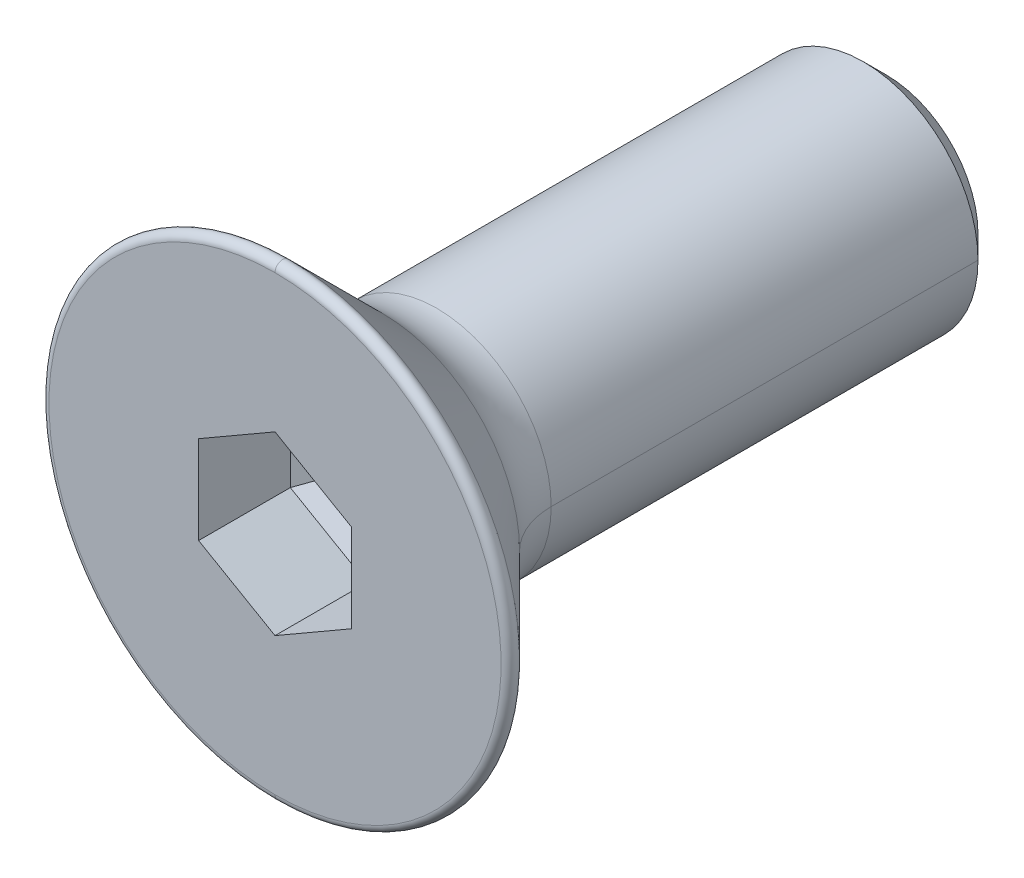
ISO-10303-21;
HEADER;
FILE_DESCRIPTION(('STEP AP214'),'2;1');
FILE_NAME('part.step','',(''),(''),'','','');
FILE_SCHEMA(('AUTOMOTIVE_DESIGN { 1 0 10303 214 1 1 1 1 }'));
ENDSEC;
DATA;
#1=APPLICATION_CONTEXT('core data for automotive mechanical design processes');
#2=APPLICATION_PROTOCOL_DEFINITION('international standard','automotive_design',2000,#1);
#3=PRODUCT_CONTEXT('',#1,'mechanical');
#4=PRODUCT('Part','Part','',(#3));
#5=PRODUCT_RELATED_PRODUCT_CATEGORY('part','',(#4));
#6=PRODUCT_DEFINITION_FORMATION('','',#4);
#7=PRODUCT_DEFINITION_CONTEXT('part definition',#1,'design');
#8=PRODUCT_DEFINITION('design','',#6,#7);
#9=PRODUCT_DEFINITION_SHAPE('','',#8);
#10=(LENGTH_UNIT() NAMED_UNIT(*) SI_UNIT(.MILLI.,.METRE.));
#11=(NAMED_UNIT(*) PLANE_ANGLE_UNIT() SI_UNIT($,.RADIAN.));
#12=(NAMED_UNIT(*) SI_UNIT($,.STERADIAN.) SOLID_ANGLE_UNIT());
#13=UNCERTAINTY_MEASURE_WITH_UNIT(LENGTH_MEASURE(1.E-05),#10,'distance_accuracy_value','');
#14=(GEOMETRIC_REPRESENTATION_CONTEXT(3) GLOBAL_UNCERTAINTY_ASSIGNED_CONTEXT((#13)) GLOBAL_UNIT_ASSIGNED_CONTEXT((#10,
#11,#12)) REPRESENTATION_CONTEXT('',''));
#15=CARTESIAN_POINT('',(0.,0.,0.));
#16=DIRECTION('',(0.,0.,1.));
#17=DIRECTION('',(1.,0.,0.));
#18=AXIS2_PLACEMENT_3D('',#15,#16,#17);
#19=CARTESIAN_POINT('',(0.,0.,0.));
#20=DIRECTION('',(0.,0.,1.));
#21=DIRECTION('',(1.,0.,0.));
#22=AXIS2_PLACEMENT_3D('',#19,#20,#21);
#23=PLANE('',#22);
#24=CARTESIAN_POINT('',(0.,0.,-1.952411139428E-07));
#25=DIRECTION('',(0.,0.,-1.));
#26=DIRECTION('',(1.,0.,0.));
#27=AXIS2_PLACEMENT_3D('',#24,#25,#26);
#28=CIRCLE('',#27,1.200000028684);
#29=CARTESIAN_POINT('',(1.200000028684,0.,-1.952411139428E-07));
#30=VERTEX_POINT('',#29);
#31=CARTESIAN_POINT('',(-1.200000028684,0.,-1.952411139428E-07));
#32=VERTEX_POINT('',#31);
#33=EDGE_CURVE('E11',#30,#32,#28,.T.);
#34=ORIENTED_EDGE('',*,*,#33,.T.);
#35=CARTESIAN_POINT('',(0.,0.,-1.952411139428E-07));
#36=DIRECTION('',(0.,0.,-1.));
#37=DIRECTION('',(-1.,0.,0.));
#38=AXIS2_PLACEMENT_3D('',#35,#36,#37);
#39=CIRCLE('',#38,1.200000028684);
#40=EDGE_CURVE('E28',#32,#30,#39,.T.);
#41=ORIENTED_EDGE('',*,*,#40,.T.);
#42=EDGE_LOOP('',(#34,#41));
#43=FACE_BOUND('',#42,.T.);
#44=ADVANCED_FACE('F17',(#43),#23,.F.);
#45=CARTESIAN_POINT('',(0.,0.,0.1499999993561));
#46=DIRECTION('',(0.,0.,1.));
#47=DIRECTION('',(0.,-1.,0.));
#48=AXIS2_PLACEMENT_3D('',#45,#46,#47);
#49=CONICAL_SURFACE('',#48,1.350000251272,0.785398256699461);
#50=DIRECTION('',(-0.707106770190798,1.62505001967499E-11,0.707106792182297));
#51=VECTOR('',#50,1.);
#52=CARTESIAN_POINT('',(-1.200000074636,-1.103087927678E-10,-7.464715801042E-08));
#53=LINE('',#52,#51);
#54=CARTESIAN_POINT('',(-1.5,0.,0.3000002107158));
#55=VERTEX_POINT('',#54);
#56=EDGE_CURVE('E21',#32,#55,#53,.T.);
#57=ORIENTED_EDGE('',*,*,#56,.T.);
#58=CARTESIAN_POINT('',(0.,0.,0.3000002107158));
#59=DIRECTION('',(0.,0.,-1.));
#60=DIRECTION('',(-1.,0.,0.));
#61=AXIS2_PLACEMENT_3D('',#58,#59,#60);
#62=CIRCLE('',#61,1.5);
#63=CARTESIAN_POINT('',(1.5,0.,0.3000002107158));
#64=VERTEX_POINT('',#63);
#65=EDGE_CURVE('E236',#55,#64,#62,.T.);
#66=ORIENTED_EDGE('',*,*,#65,.T.);
#67=DIRECTION('',(0.707106770190798,-1.62504382324799E-11,0.707106792182297));
#68=VECTOR('',#67,1.);
#69=CARTESIAN_POINT('',(1.200000074636,1.103092895437E-10,-7.464715778838E-08));
#70=LINE('',#69,#68);
#71=EDGE_CURVE('E232',#30,#64,#70,.T.);
#72=ORIENTED_EDGE('',*,*,#71,.F.);
#73=ORIENTED_EDGE('',*,*,#40,.F.);
#74=EDGE_LOOP('',(#57,#66,#72,#73));
#75=FACE_BOUND('',#74,.T.);
#76=ADVANCED_FACE('F369',(#75),#49,.T.);
#77=CARTESIAN_POINT('',(0.,0.,0.1499999993561));
#78=DIRECTION('',(0.,0.,1.));
#79=DIRECTION('',(0.,-1.,0.));
#80=AXIS2_PLACEMENT_3D('',#77,#78,#79);
#81=CONICAL_SURFACE('',#80,1.350000251272,0.785398256699461);
#82=ORIENTED_EDGE('',*,*,#71,.T.);
#83=CARTESIAN_POINT('',(0.,0.,0.3000002107158));
#84=DIRECTION('',(0.,0.,-1.));
#85=DIRECTION('',(1.,0.,0.));
#86=AXIS2_PLACEMENT_3D('',#83,#84,#85);
#87=CIRCLE('',#86,1.5);
#88=EDGE_CURVE('E237',#64,#55,#87,.T.);
#89=ORIENTED_EDGE('',*,*,#88,.T.);
#90=ORIENTED_EDGE('',*,*,#56,.F.);
#91=ORIENTED_EDGE('',*,*,#33,.F.);
#92=EDGE_LOOP('',(#82,#89,#90,#91));
#93=FACE_BOUND('',#92,.T.);
#94=ADVANCED_FACE('F361',(#93),#81,.T.);
#95=CARTESIAN_POINT('',(0.,0.,0.));
#96=DIRECTION('',(0.,0.,1.));
#97=DIRECTION('',(1.,0.,0.));
#98=AXIS2_PLACEMENT_3D('',#95,#96,#97);
#99=CYLINDRICAL_SURFACE('',#98,1.5);
#100=DIRECTION('',(1.252670065483E-08,1.869056244616E-11,1.));
#101=VECTOR('',#100,1.);
#102=CARTESIAN_POINT('',(-1.500000069971,-1.034142894357E-10,0.2999999300183));
#103=LINE('',#102,#101);
#104=CARTESIAN_POINT('',(-1.5,0.,5.885786437627));
#105=VERTEX_POINT('',#104);
#106=EDGE_CURVE('E261',#55,#105,#103,.T.);
#107=ORIENTED_EDGE('',*,*,#106,.F.);
#108=ORIENTED_EDGE('',*,*,#88,.F.);
#109=DIRECTION('',(-1.252670065483E-08,-1.877894840094E-11,1.));
#110=VECTOR('',#109,1.);
#111=CARTESIAN_POINT('',(1.500000069971,1.034148125009E-10,0.2999999300183));
#112=LINE('',#111,#110);
#113=CARTESIAN_POINT('',(1.5,0.,5.885786437627));
#114=VERTEX_POINT('',#113);
#115=EDGE_CURVE('E347',#64,#114,#112,.T.);
#116=ORIENTED_EDGE('',*,*,#115,.T.);
#117=CARTESIAN_POINT('',(0.,0.,5.885786437627));
#118=DIRECTION('',(0.,0.,1.));
#119=DIRECTION('',(0.,-1.,0.));
#120=AXIS2_PLACEMENT_3D('',#117,#118,#119);
#121=CIRCLE('',#120,1.5);
#122=CARTESIAN_POINT('',(0.,-1.5,5.885786437627));
#123=VERTEX_POINT('',#122);
#124=EDGE_CURVE('E175',#123,#114,#121,.T.);
#125=ORIENTED_EDGE('',*,*,#124,.F.);
#126=CARTESIAN_POINT('',(0.,0.,5.885786437627));
#127=DIRECTION('',(0.,0.,1.));
#128=DIRECTION('',(-1.,0.,0.));
#129=AXIS2_PLACEMENT_3D('',#126,#127,#128);
#130=CIRCLE('',#129,1.5);
#131=EDGE_CURVE('E346',#105,#123,#130,.T.);
#132=ORIENTED_EDGE('',*,*,#131,.F.);
#133=EDGE_LOOP('',(#107,#108,#116,#125,#132));
#134=FACE_BOUND('',#133,.T.);
#135=ADVANCED_FACE('F371',(#134),#99,.T.);
#136=CARTESIAN_POINT('',(0.,0.,5.885786437627));
#137=DIRECTION('',(0.,0.,1.));
#138=DIRECTION('',(0.0112297805153396,0.999936944026761,0.));
#139=AXIS2_PLACEMENT_3D('',#136,#137,#138);
#140=TOROIDAL_SURFACE('',#139,2.5,1.);
#141=CARTESIAN_POINT('',(0.,0.,6.592893218813));
#142=DIRECTION('',(0.,0.,1.));
#143=DIRECTION('',(1.,0.,0.));
#144=AXIS2_PLACEMENT_3D('',#141,#142,#143);
#145=CIRCLE('',#144,1.792893218813);
#146=CARTESIAN_POINT('',(1.792893218813,0.,6.592893218813));
#147=VERTEX_POINT('',#146);
#148=CARTESIAN_POINT('',(0.,1.792893218813,6.592893218813));
#149=VERTEX_POINT('',#148);
#150=EDGE_CURVE('E141',#147,#149,#145,.T.);
#151=ORIENTED_EDGE('',*,*,#150,.F.);
#152=CARTESIAN_POINT('',(2.5,-7.775573587776E-11,5.885786437627));
#153=DIRECTION('',(3.11022943511E-11,1.,0.));
#154=DIRECTION('',(-1.,3.11022943511E-11,0.));
#155=AXIS2_PLACEMENT_3D('',#152,#153,#154);
#156=CIRCLE('',#155,1.);
#157=EDGE_CURVE('E170',#114,#147,#156,.T.);
#158=ORIENTED_EDGE('',*,*,#157,.F.);
#159=CARTESIAN_POINT('',(0.,0.,5.885786437627));
#160=DIRECTION('',(0.,0.,-1.));
#161=DIRECTION('',(-1.,0.,0.));
#162=AXIS2_PLACEMENT_3D('',#159,#160,#161);
#163=CIRCLE('',#162,1.5);
#164=EDGE_CURVE('E264',#105,#114,#163,.T.);
#165=ORIENTED_EDGE('',*,*,#164,.F.);
#166=ORIENTED_EDGE('',*,*,#131,.T.);
#167=CARTESIAN_POINT('',(-6.038500255379E-11,-2.5,5.885786437627));
#168=DIRECTION('',(1.,-2.415399998068E-11,0.));
#169=DIRECTION('',(2.415399998068E-11,1.,0.));
#170=AXIS2_PLACEMENT_3D('',#167,#168,#169);
#171=CIRCLE('',#170,1.);
#172=CARTESIAN_POINT('',(0.,-1.792893218813,6.592893218813));
#173=VERTEX_POINT('',#172);
#174=EDGE_CURVE('E159',#123,#173,#171,.T.);
#175=ORIENTED_EDGE('',*,*,#174,.T.);
#176=CARTESIAN_POINT('',(0.,0.,6.592893218813));
#177=DIRECTION('',(0.,0.,1.));
#178=DIRECTION('',(0.,1.,0.));
#179=AXIS2_PLACEMENT_3D('',#176,#177,#178);
#180=CIRCLE('',#179,1.792893218813);
#181=EDGE_CURVE('E155',#149,#173,#180,.T.);
#182=ORIENTED_EDGE('',*,*,#181,.F.);
#183=EDGE_LOOP('',(#151,#158,#165,#166,#175,#182));
#184=FACE_BOUND('',#183,.T.);
#185=ADVANCED_FACE('F156',(#184),#140,.F.);
#186=CARTESIAN_POINT('',(0.,0.,7.211091270347));
#187=DIRECTION('',(0.,0.,1.));
#188=DIRECTION('',(0.,1.,0.));
#189=AXIS2_PLACEMENT_3D('',#186,#187,#188);
#190=CONICAL_SURFACE('',#189,2.411091270347,0.7853981633973);
#191=DIRECTION('',(6.06092770314041E-12,0.707106781186548,0.707106781186548));
#192=VECTOR('',#191,1.);
#193=CARTESIAN_POINT('',(2.499026116087E-13,1.792893218813,6.592893218813));
#194=LINE('',#193,#192);
#195=CARTESIAN_POINT('',(0.,3.029289321881,7.829289321881));
#196=VERTEX_POINT('',#195);
#197=EDGE_CURVE('E145',#149,#196,#194,.T.);
#198=ORIENTED_EDGE('',*,*,#197,.F.);
#199=ORIENTED_EDGE('',*,*,#181,.T.);
#200=DIRECTION('',(-5.9891911487134E-12,-0.707106781186548,0.707106781186548));
#201=VECTOR('',#200,1.);
#202=CARTESIAN_POINT('',(-3.749178544476E-13,-1.792893218814,6.592893218814));
#203=LINE('',#202,#201);
#204=CARTESIAN_POINT('',(0.,-3.029289321881,7.829289321881));
#205=VERTEX_POINT('',#204);
#206=EDGE_CURVE('E163',#173,#205,#203,.T.);
#207=ORIENTED_EDGE('',*,*,#206,.T.);
#208=CARTESIAN_POINT('',(0.,0.,7.829289321881));
#209=DIRECTION('',(0.,0.,1.));
#210=DIRECTION('',(0.,1.,0.));
#211=AXIS2_PLACEMENT_3D('',#208,#209,#210);
#212=CIRCLE('',#211,3.029289321881);
#213=EDGE_CURVE('E167',#196,#205,#212,.T.);
#214=ORIENTED_EDGE('',*,*,#213,.F.);
#215=EDGE_LOOP('',(#198,#199,#207,#214));
#216=FACE_BOUND('',#215,.T.);
#217=ADVANCED_FACE('F165',(#216),#190,.T.);
#218=CARTESIAN_POINT('',(0.,0.,7.9));
#219=DIRECTION('',(0.,0.,-1.));
#220=DIRECTION('',(0.0105710441719905,0.999944124951546,0.));
#221=AXIS2_PLACEMENT_3D('',#218,#219,#220);
#222=TOROIDAL_SURFACE('',#221,2.958578643763,0.1);
#223=CARTESIAN_POINT('',(0.,2.958578643763,7.9));
#224=DIRECTION('',(-1.,0.,0.));
#225=DIRECTION('',(0.,0.,1.));
#226=AXIS2_PLACEMENT_3D('',#223,#224,#225);
#227=CIRCLE('',#226,0.1);
#228=CARTESIAN_POINT('',(0.,2.958578643763,8.));
#229=VERTEX_POINT('',#228);
#230=EDGE_CURVE('E179',#229,#196,#227,.T.);
#231=ORIENTED_EDGE('',*,*,#230,.T.);
#232=ORIENTED_EDGE('',*,*,#213,.T.);
#233=CARTESIAN_POINT('',(0.,-2.958578643763,7.9));
#234=DIRECTION('',(1.,0.,0.));
#235=DIRECTION('',(0.,0.,1.));
#236=AXIS2_PLACEMENT_3D('',#233,#234,#235);
#237=CIRCLE('',#236,0.1);
#238=CARTESIAN_POINT('',(0.,-2.958578643763,8.));
#239=VERTEX_POINT('',#238);
#240=EDGE_CURVE('E216',#239,#205,#237,.T.);
#241=ORIENTED_EDGE('',*,*,#240,.F.);
#242=CARTESIAN_POINT('',(0.,0.,8.));
#243=DIRECTION('',(0.,0.,1.));
#244=DIRECTION('',(0.,1.,0.));
#245=AXIS2_PLACEMENT_3D('',#242,#243,#244);
#246=CIRCLE('',#245,2.958578643763);
#247=EDGE_CURVE('E221',#229,#239,#246,.T.);
#248=ORIENTED_EDGE('',*,*,#247,.F.);
#249=EDGE_LOOP('',(#231,#232,#241,#248));
#250=FACE_BOUND('',#249,.T.);
#251=ADVANCED_FACE('F430',(#250),#222,.T.);
#252=CARTESIAN_POINT('',(0.,0.,8.));
#253=DIRECTION('',(0.,0.,-1.));
#254=DIRECTION('',(0.,-1.,0.));
#255=AXIS2_PLACEMENT_3D('',#252,#253,#254);
#256=PLANE('',#255);
#257=ORIENTED_EDGE('',*,*,#247,.T.);
#258=CARTESIAN_POINT('',(0.,0.,8.));
#259=DIRECTION('',(0.,0.,1.));
#260=DIRECTION('',(0.,-1.,0.));
#261=AXIS2_PLACEMENT_3D('',#258,#259,#260);
#262=CIRCLE('',#261,2.958578643763);
#263=EDGE_CURVE('E227',#239,#229,#262,.T.);
#264=ORIENTED_EDGE('',*,*,#263,.T.);
#265=EDGE_LOOP('',(#257,#264));
#266=FACE_BOUND('',#265,.T.);
#267=DIRECTION('',(0.866025403784429,-0.500000000000017,0.));
#268=VECTOR('',#267,1.);
#269=CARTESIAN_POINT('',(-1.,-0.5773502691896,8.));
#270=LINE('',#269,#268);
#271=CARTESIAN_POINT('',(-1.,-0.5773502691896,8.));
#272=VERTEX_POINT('',#271);
#273=CARTESIAN_POINT('',(0.,-1.154700538379,8.));
#274=VERTEX_POINT('',#273);
#275=EDGE_CURVE('E246',#272,#274,#270,.T.);
#276=ORIENTED_EDGE('',*,*,#275,.F.);
#277=DIRECTION('',(0.,-1.,0.));
#278=VECTOR('',#277,1.);
#279=CARTESIAN_POINT('',(-1.,0.5773502691896,8.));
#280=LINE('',#279,#278);
#281=CARTESIAN_POINT('',(-1.,0.5773502691896,8.));
#282=VERTEX_POINT('',#281);
#283=EDGE_CURVE('E255',#282,#272,#280,.T.);
#284=ORIENTED_EDGE('',*,*,#283,.F.);
#285=DIRECTION('',(-0.866025403784429,-0.500000000000017,0.));
#286=VECTOR('',#285,1.);
#287=CARTESIAN_POINT('',(0.,1.154700538379,8.));
#288=LINE('',#287,#286);
#289=CARTESIAN_POINT('',(0.,1.154700538379,8.));
#290=VERTEX_POINT('',#289);
#291=EDGE_CURVE('E208',#290,#282,#288,.T.);
#292=ORIENTED_EDGE('',*,*,#291,.F.);
#293=DIRECTION('',(-0.866025403784429,0.500000000000017,0.));
#294=VECTOR('',#293,1.);
#295=CARTESIAN_POINT('',(1.,0.5773502691896,8.));
#296=LINE('',#295,#294);
#297=CARTESIAN_POINT('',(1.,0.5773502691896,8.));
#298=VERTEX_POINT('',#297);
#299=EDGE_CURVE('E260',#298,#290,#296,.T.);
#300=ORIENTED_EDGE('',*,*,#299,.F.);
#301=DIRECTION('',(0.,1.,0.));
#302=VECTOR('',#301,1.);
#303=CARTESIAN_POINT('',(1.,-0.5773502691896,8.));
#304=LINE('',#303,#302);
#305=CARTESIAN_POINT('',(1.,-0.5773502691896,8.));
#306=VERTEX_POINT('',#305);
#307=EDGE_CURVE('E247',#306,#298,#304,.T.);
#308=ORIENTED_EDGE('',*,*,#307,.F.);
#309=DIRECTION('',(0.866025403784429,0.500000000000017,0.));
#310=VECTOR('',#309,1.);
#311=CARTESIAN_POINT('',(0.,-1.154700538379,8.));
#312=LINE('',#311,#310);
#313=EDGE_CURVE('E223',#274,#306,#312,.T.);
#314=ORIENTED_EDGE('',*,*,#313,.F.);
#315=EDGE_LOOP('',(#276,#284,#292,#300,#308,#314));
#316=FACE_BOUND('',#315,.T.);
#317=ADVANCED_FACE('F401',(#266,#316),#256,.F.);
#318=CARTESIAN_POINT('',(0.,-1.154700538379,8.));
#319=DIRECTION('',(0.500000000000017,-0.866025403784429,0.));
#320=DIRECTION('',(0.,0.,-1.));
#321=AXIS2_PLACEMENT_3D('',#318,#319,#320);
#322=PLANE('',#321);
#323=DIRECTION('',(0.,0.,-1.));
#324=VECTOR('',#323,1.);
#325=CARTESIAN_POINT('',(0.,-1.154700538379,8.));
#326=LINE('',#325,#324);
#327=CARTESIAN_POINT('',(0.,-1.154700538379,6.8));
#328=VERTEX_POINT('',#327);
#329=EDGE_CURVE('E276',#274,#328,#326,.T.);
#330=ORIENTED_EDGE('',*,*,#329,.F.);
#331=ORIENTED_EDGE('',*,*,#313,.T.);
#332=DIRECTION('',(0.,0.,-1.));
#333=VECTOR('',#332,1.);
#334=CARTESIAN_POINT('',(1.,-0.5773502691896,8.));
#335=LINE('',#334,#333);
#336=CARTESIAN_POINT('',(1.,-0.5773502691896,6.8));
#337=VERTEX_POINT('',#336);
#338=EDGE_CURVE('E197',#306,#337,#335,.T.);
#339=ORIENTED_EDGE('',*,*,#338,.T.);
#340=DIRECTION('',(0.866025403784429,0.500000000000017,0.));
#341=VECTOR('',#340,1.);
#342=CARTESIAN_POINT('',(0.,-1.154700538379,6.8));
#343=LINE('',#342,#341);
#344=EDGE_CURVE('E198',#328,#337,#343,.T.);
#345=ORIENTED_EDGE('',*,*,#344,.F.);
#346=EDGE_LOOP('',(#330,#331,#339,#345));
#347=FACE_BOUND('',#346,.T.);
#348=ADVANCED_FACE('F397',(#347),#322,.F.);
#349=CARTESIAN_POINT('',(0.2608253175473,-0.4517627018922,6.5));
#350=DIRECTION('',(0.265656082646606,-0.46012983248361,-0.847176122781718));
#351=DIRECTION('',(0.,-0.878751543029884,0.477279504716678));
#352=AXIS2_PLACEMENT_3D('',#349,#350,#351);
#353=PLANE('',#352);
#354=DIRECTION('',(0.761021159878637,-0.439375771514922,0.477279504716724));
#355=VECTOR('',#354,1.);
#356=CARTESIAN_POINT('',(0.04330127018922,-0.025,6.2));
#357=LINE('',#356,#355);
#358=CARTESIAN_POINT('',(0.04330127018922,-0.025,6.2));
#359=VERTEX_POINT('',#358);
#360=EDGE_CURVE('E228',#359,#337,#357,.T.);
#361=ORIENTED_EDGE('',*,*,#360,.F.);
#362=DIRECTION('',(0.866025403784429,0.500000000000017,0.));
#363=VECTOR('',#362,1.);
#364=CARTESIAN_POINT('',(0.,-0.05,6.2));
#365=LINE('',#364,#363);
#366=CARTESIAN_POINT('',(0.,-0.05,6.2));
#367=VERTEX_POINT('',#366);
#368=EDGE_CURVE('E212',#367,#359,#365,.T.);
#369=ORIENTED_EDGE('',*,*,#368,.F.);
#370=DIRECTION('',(0.,-0.878751543029879,0.477279504716689));
#371=VECTOR('',#370,1.);
#372=CARTESIAN_POINT('',(0.,-0.05,6.2));
#373=LINE('',#372,#371);
#374=EDGE_CURVE('E193',#367,#328,#373,.T.);
#375=ORIENTED_EDGE('',*,*,#374,.T.);
#376=ORIENTED_EDGE('',*,*,#344,.T.);
#377=EDGE_LOOP('',(#361,#369,#375,#376));
#378=FACE_BOUND('',#377,.T.);
#379=ADVANCED_FACE('F400',(#378),#353,.F.);
#380=CARTESIAN_POINT('',(-0.2608253175473,-0.4517627018922,6.5));
#381=DIRECTION('',(-0.265656082646606,-0.46012983248361,-0.847176122781718));
#382=DIRECTION('',(0.,-0.878751543029884,0.477279504716678));
#383=AXIS2_PLACEMENT_3D('',#380,#381,#382);
#384=PLANE('',#383);
#385=ORIENTED_EDGE('',*,*,#374,.F.);
#386=DIRECTION('',(0.866025403784429,-0.500000000000017,0.));
#387=VECTOR('',#386,1.);
#388=CARTESIAN_POINT('',(-0.04330127018922,-0.025,6.2));
#389=LINE('',#388,#387);
#390=CARTESIAN_POINT('',(-0.04330127018922,-0.025,6.2));
#391=VERTEX_POINT('',#390);
#392=EDGE_CURVE('E215',#391,#367,#389,.T.);
#393=ORIENTED_EDGE('',*,*,#392,.F.);
#394=DIRECTION('',(-0.761021159878637,-0.439375771514922,0.477279504716724));
#395=VECTOR('',#394,1.);
#396=CARTESIAN_POINT('',(-0.04330127018922,-0.025,6.2));
#397=LINE('',#396,#395);
#398=CARTESIAN_POINT('',(-1.,-0.5773502691896,6.8));
#399=VERTEX_POINT('',#398);
#400=EDGE_CURVE('E241',#391,#399,#397,.T.);
#401=ORIENTED_EDGE('',*,*,#400,.T.);
#402=DIRECTION('',(0.866025403784429,-0.500000000000017,0.));
#403=VECTOR('',#402,1.);
#404=CARTESIAN_POINT('',(-1.,-0.5773502691896,6.8));
#405=LINE('',#404,#403);
#406=EDGE_CURVE('E242',#399,#328,#405,.T.);
#407=ORIENTED_EDGE('',*,*,#406,.T.);
#408=EDGE_LOOP('',(#385,#393,#401,#407));
#409=FACE_BOUND('',#408,.T.);
#410=ADVANCED_FACE('F411',(#409),#384,.F.);
#411=CARTESIAN_POINT('',(-1.,-0.5773502691896,8.));
#412=DIRECTION('',(-0.500000000000017,-0.866025403784429,0.));
#413=DIRECTION('',(-0.866025403784429,0.500000000000017,0.));
#414=AXIS2_PLACEMENT_3D('',#411,#412,#413);
#415=PLANE('',#414);
#416=DIRECTION('',(0.,0.,-1.));
#417=VECTOR('',#416,1.);
#418=CARTESIAN_POINT('',(-1.,-0.5773502691896,8.));
#419=LINE('',#418,#417);
#420=EDGE_CURVE('E251',#272,#399,#419,.T.);
#421=ORIENTED_EDGE('',*,*,#420,.F.);
#422=ORIENTED_EDGE('',*,*,#275,.T.);
#423=ORIENTED_EDGE('',*,*,#329,.T.);
#424=ORIENTED_EDGE('',*,*,#406,.F.);
#425=EDGE_LOOP('',(#421,#422,#423,#424));
#426=FACE_BOUND('',#425,.T.);
#427=ADVANCED_FACE('F406',(#426),#415,.F.);
#428=CARTESIAN_POINT('',(-1.,0.5773502691896,8.));
#429=DIRECTION('',(-1.,0.,0.));
#430=DIRECTION('',(0.,0.,1.));
#431=AXIS2_PLACEMENT_3D('',#428,#429,#430);
#432=PLANE('',#431);
#433=DIRECTION('',(0.,0.,-1.));
#434=VECTOR('',#433,1.);
#435=CARTESIAN_POINT('',(-1.,0.5773502691896,8.));
#436=LINE('',#435,#434);
#437=CARTESIAN_POINT('',(-1.,0.5773502691896,6.8));
#438=VERTEX_POINT('',#437);
#439=EDGE_CURVE('E257',#282,#438,#436,.T.);
#440=ORIENTED_EDGE('',*,*,#439,.F.);
#441=ORIENTED_EDGE('',*,*,#283,.T.);
#442=ORIENTED_EDGE('',*,*,#420,.T.);
#443=DIRECTION('',(0.,-1.,0.));
#444=VECTOR('',#443,1.);
#445=CARTESIAN_POINT('',(-1.,0.5773502691896,6.8));
#446=LINE('',#445,#444);
#447=EDGE_CURVE('E297',#438,#399,#446,.T.);
#448=ORIENTED_EDGE('',*,*,#447,.F.);
#449=EDGE_LOOP('',(#440,#441,#442,#448));
#450=FACE_BOUND('',#449,.T.);
#451=ADVANCED_FACE('F403',(#450),#432,.F.);
#452=CARTESIAN_POINT('',(-0.5216506350946,0.,6.5));
#453=DIRECTION('',(-0.531312165293205,0.,-0.847176122781707));
#454=DIRECTION('',(-0.847176122781707,0.,0.531312165293205));
#455=AXIS2_PLACEMENT_3D('',#452,#453,#454);
#456=PLANE('',#455);
#457=ORIENTED_EDGE('',*,*,#400,.F.);
#458=DIRECTION('',(0.,-1.,0.));
#459=VECTOR('',#458,1.);
#460=CARTESIAN_POINT('',(-0.04330127018922,0.025,6.2));
#461=LINE('',#460,#459);
#462=CARTESIAN_POINT('',(-0.04330127018922,0.025,6.2));
#463=VERTEX_POINT('',#462);
#464=EDGE_CURVE('E192',#463,#391,#461,.T.);
#465=ORIENTED_EDGE('',*,*,#464,.F.);
#466=DIRECTION('',(-0.761021159878637,0.439375771514922,0.477279504716724));
#467=VECTOR('',#466,1.);
#468=CARTESIAN_POINT('',(-0.04330127018922,0.025,6.2));
#469=LINE('',#468,#467);
#470=EDGE_CURVE('E256',#463,#438,#469,.T.);
#471=ORIENTED_EDGE('',*,*,#470,.T.);
#472=ORIENTED_EDGE('',*,*,#447,.T.);
#473=EDGE_LOOP('',(#457,#465,#471,#472));
#474=FACE_BOUND('',#473,.T.);
#475=ADVANCED_FACE('F405',(#474),#456,.F.);
#476=CARTESIAN_POINT('',(-0.2608253175473,0.4517627018922,6.5));
#477=DIRECTION('',(-0.265656082646606,0.46012983248361,-0.847176122781718));
#478=DIRECTION('',(-0.954186581645934,0.,0.299212244747516));
#479=AXIS2_PLACEMENT_3D('',#476,#477,#478);
#480=PLANE('',#479);
#481=ORIENTED_EDGE('',*,*,#470,.F.);
#482=DIRECTION('',(-0.866025403784429,-0.500000000000017,0.));
#483=VECTOR('',#482,1.);
#484=CARTESIAN_POINT('',(0.,0.05,6.2));
#485=LINE('',#484,#483);
#486=CARTESIAN_POINT('',(0.,0.05,6.2));
#487=VERTEX_POINT('',#486);
#488=EDGE_CURVE('E187',#487,#463,#485,.T.);
#489=ORIENTED_EDGE('',*,*,#488,.F.);
#490=DIRECTION('',(0.,0.878751543029879,0.477279504716689));
#491=VECTOR('',#490,1.);
#492=CARTESIAN_POINT('',(0.,0.05,6.2));
#493=LINE('',#492,#491);
#494=CARTESIAN_POINT('',(0.,1.154700538379,6.8));
#495=VERTEX_POINT('',#494);
#496=EDGE_CURVE('E207',#487,#495,#493,.T.);
#497=ORIENTED_EDGE('',*,*,#496,.T.);
#498=DIRECTION('',(-0.866025403784429,-0.500000000000017,0.));
#499=VECTOR('',#498,1.);
#500=CARTESIAN_POINT('',(0.,1.154700538379,6.8));
#501=LINE('',#500,#499);
#502=EDGE_CURVE('E203',#495,#438,#501,.T.);
#503=ORIENTED_EDGE('',*,*,#502,.T.);
#504=EDGE_LOOP('',(#481,#489,#497,#503));
#505=FACE_BOUND('',#504,.T.);
#506=ADVANCED_FACE('F582',(#505),#480,.F.);
#507=CARTESIAN_POINT('',(0.,1.154700538379,8.));
#508=DIRECTION('',(-0.500000000000017,0.866025403784429,0.));
#509=DIRECTION('',(0.,0.,1.));
#510=AXIS2_PLACEMENT_3D('',#507,#508,#509);
#511=PLANE('',#510);
#512=DIRECTION('',(0.,0.,-1.));
#513=VECTOR('',#512,1.);
#514=CARTESIAN_POINT('',(0.,1.154700538379,8.));
#515=LINE('',#514,#513);
#516=EDGE_CURVE('E185',#290,#495,#515,.T.);
#517=ORIENTED_EDGE('',*,*,#516,.F.);
#518=ORIENTED_EDGE('',*,*,#291,.T.);
#519=ORIENTED_EDGE('',*,*,#439,.T.);
#520=ORIENTED_EDGE('',*,*,#502,.F.);
#521=EDGE_LOOP('',(#517,#518,#519,#520));
#522=FACE_BOUND('',#521,.T.);
#523=ADVANCED_FACE('F576',(#522),#511,.F.);
#524=CARTESIAN_POINT('',(1.,0.5773502691896,8.));
#525=DIRECTION('',(0.500000000000017,0.866025403784429,0.));
#526=DIRECTION('',(0.,0.,-1.));
#527=AXIS2_PLACEMENT_3D('',#524,#525,#526);
#528=PLANE('',#527);
#529=DIRECTION('',(0.,0.,-1.));
#530=VECTOR('',#529,1.);
#531=CARTESIAN_POINT('',(1.,0.5773502691896,8.));
#532=LINE('',#531,#530);
#533=CARTESIAN_POINT('',(1.,0.5773502691896,6.8));
#534=VERTEX_POINT('',#533);
#535=EDGE_CURVE('E250',#298,#534,#532,.T.);
#536=ORIENTED_EDGE('',*,*,#535,.F.);
#537=ORIENTED_EDGE('',*,*,#299,.T.);
#538=ORIENTED_EDGE('',*,*,#516,.T.);
#539=DIRECTION('',(-0.866025403784429,0.500000000000017,0.));
#540=VECTOR('',#539,1.);
#541=CARTESIAN_POINT('',(1.,0.5773502691896,6.8));
#542=LINE('',#541,#540);
#543=EDGE_CURVE('E186',#534,#495,#542,.T.);
#544=ORIENTED_EDGE('',*,*,#543,.F.);
#545=EDGE_LOOP('',(#536,#537,#538,#544));
#546=FACE_BOUND('',#545,.T.);
#547=ADVANCED_FACE('F581',(#546),#528,.F.);
#548=CARTESIAN_POINT('',(0.2608253175473,0.4517627018922,6.5));
#549=DIRECTION('',(0.265656082646606,0.46012983248361,-0.847176122781718));
#550=DIRECTION('',(-0.954186581645934,0.,-0.299212244747516));
#551=AXIS2_PLACEMENT_3D('',#548,#549,#550);
#552=PLANE('',#551);
#553=ORIENTED_EDGE('',*,*,#496,.F.);
#554=DIRECTION('',(-0.866025403784429,0.500000000000017,0.));
#555=VECTOR('',#554,1.);
#556=CARTESIAN_POINT('',(0.04330127018922,0.025,6.2));
#557=LINE('',#556,#555);
#558=CARTESIAN_POINT('',(0.04330127018922,0.025,6.2));
#559=VERTEX_POINT('',#558);
#560=EDGE_CURVE('E191',#559,#487,#557,.T.);
#561=ORIENTED_EDGE('',*,*,#560,.F.);
#562=DIRECTION('',(0.761021159878637,0.439375771514922,0.477279504716724));
#563=VECTOR('',#562,1.);
#564=CARTESIAN_POINT('',(0.04330127018922,0.025,6.2));
#565=LINE('',#564,#563);
#566=EDGE_CURVE('E181',#559,#534,#565,.T.);
#567=ORIENTED_EDGE('',*,*,#566,.T.);
#568=ORIENTED_EDGE('',*,*,#543,.T.);
#569=EDGE_LOOP('',(#553,#561,#567,#568));
#570=FACE_BOUND('',#569,.T.);
#571=ADVANCED_FACE('F318',(#570),#552,.F.);
#572=CARTESIAN_POINT('',(0.5216506350946,0.,6.5));
#573=DIRECTION('',(0.531312165293205,0.,-0.847176122781707));
#574=DIRECTION('',(0.,-1.,0.));
#575=AXIS2_PLACEMENT_3D('',#572,#573,#574);
#576=PLANE('',#575);
#577=ORIENTED_EDGE('',*,*,#566,.F.);
#578=DIRECTION('',(0.,1.,0.));
#579=VECTOR('',#578,1.);
#580=CARTESIAN_POINT('',(0.04330127018922,-0.025,6.2));
#581=LINE('',#580,#579);
#582=EDGE_CURVE('E202',#359,#559,#581,.T.);
#583=ORIENTED_EDGE('',*,*,#582,.F.);
#584=ORIENTED_EDGE('',*,*,#360,.T.);
#585=DIRECTION('',(0.,1.,0.));
#586=VECTOR('',#585,1.);
#587=CARTESIAN_POINT('',(1.,-0.5773502691896,6.8));
#588=LINE('',#587,#586);
#589=EDGE_CURVE('E230',#337,#534,#588,.T.);
#590=ORIENTED_EDGE('',*,*,#589,.T.);
#591=EDGE_LOOP('',(#577,#583,#584,#590));
#592=FACE_BOUND('',#591,.T.);
#593=ADVANCED_FACE('F313',(#592),#576,.F.);
#594=CARTESIAN_POINT('',(1.,-0.5773502691896,8.));
#595=DIRECTION('',(1.,0.,0.));
#596=DIRECTION('',(0.,1.,0.));
#597=AXIS2_PLACEMENT_3D('',#594,#595,#596);
#598=PLANE('',#597);
#599=ORIENTED_EDGE('',*,*,#338,.F.);
#600=ORIENTED_EDGE('',*,*,#307,.T.);
#601=ORIENTED_EDGE('',*,*,#535,.T.);
#602=ORIENTED_EDGE('',*,*,#589,.F.);
#603=EDGE_LOOP('',(#599,#600,#601,#602));
#604=FACE_BOUND('',#603,.T.);
#605=ADVANCED_FACE('F415',(#604),#598,.F.);
#606=CARTESIAN_POINT('',(0.,0.,6.2));
#607=DIRECTION('',(0.,0.,1.));
#608=DIRECTION('',(1.,0.,0.));
#609=AXIS2_PLACEMENT_3D('',#606,#607,#608);
#610=PLANE('',#609);
#611=ORIENTED_EDGE('',*,*,#582,.T.);
#612=ORIENTED_EDGE('',*,*,#560,.T.);
#613=ORIENTED_EDGE('',*,*,#488,.T.);
#614=ORIENTED_EDGE('',*,*,#464,.T.);
#615=ORIENTED_EDGE('',*,*,#392,.T.);
#616=ORIENTED_EDGE('',*,*,#368,.T.);
#617=EDGE_LOOP('',(#611,#612,#613,#614,#615,#616));
#618=FACE_BOUND('',#617,.T.);
#619=ADVANCED_FACE('F309',(#618),#610,.T.);
#620=CARTESIAN_POINT('',(0.,0.,7.9));
#621=DIRECTION('',(0.,0.,-1.));
#622=DIRECTION('',(-0.0105710441719905,-0.999944124951546,0.));
#623=AXIS2_PLACEMENT_3D('',#620,#621,#622);
#624=TOROIDAL_SURFACE('',#623,2.958578643763,0.1);
#625=ORIENTED_EDGE('',*,*,#240,.T.);
#626=CARTESIAN_POINT('',(0.,0.,7.829289321881));
#627=DIRECTION('',(0.,0.,1.));
#628=DIRECTION('',(0.,-1.,0.));
#629=AXIS2_PLACEMENT_3D('',#626,#627,#628);
#630=CIRCLE('',#629,3.029289321881);
#631=EDGE_CURVE('E211',#205,#196,#630,.T.);
#632=ORIENTED_EDGE('',*,*,#631,.T.);
#633=ORIENTED_EDGE('',*,*,#230,.F.);
#634=ORIENTED_EDGE('',*,*,#263,.F.);
#635=EDGE_LOOP('',(#625,#632,#633,#634));
#636=FACE_BOUND('',#635,.T.);
#637=ADVANCED_FACE('F385',(#636),#624,.T.);
#638=CARTESIAN_POINT('',(0.,0.,7.211091270347));
#639=DIRECTION('',(0.,0.,1.));
#640=DIRECTION('',(0.,1.,0.));
#641=AXIS2_PLACEMENT_3D('',#638,#639,#640);
#642=CONICAL_SURFACE('',#641,2.411091270347,0.7853981633973);
#643=ORIENTED_EDGE('',*,*,#206,.F.);
#644=CARTESIAN_POINT('',(0.,0.,6.592893218813));
#645=DIRECTION('',(0.,0.,1.));
#646=DIRECTION('',(0.,-1.,0.));
#647=AXIS2_PLACEMENT_3D('',#644,#645,#646);
#648=CIRCLE('',#647,1.792893218813);
#649=EDGE_CURVE('E148',#173,#147,#648,.T.);
#650=ORIENTED_EDGE('',*,*,#649,.T.);
#651=ORIENTED_EDGE('',*,*,#150,.T.);
#652=ORIENTED_EDGE('',*,*,#197,.T.);
#653=ORIENTED_EDGE('',*,*,#631,.F.);
#654=EDGE_LOOP('',(#643,#650,#651,#652,#653));
#655=FACE_BOUND('',#654,.T.);
#656=ADVANCED_FACE('F19',(#655),#642,.T.);
#657=CARTESIAN_POINT('',(0.,0.,5.885786437627));
#658=DIRECTION('',(0.,0.,1.));
#659=DIRECTION('',(-0.0112297805153396,-0.999936944026761,0.));
#660=AXIS2_PLACEMENT_3D('',#657,#658,#659);
#661=TOROIDAL_SURFACE('',#660,2.5,1.);
#662=ORIENTED_EDGE('',*,*,#157,.T.);
#663=ORIENTED_EDGE('',*,*,#649,.F.);
#664=ORIENTED_EDGE('',*,*,#174,.F.);
#665=ORIENTED_EDGE('',*,*,#124,.T.);
#666=EDGE_LOOP('',(#662,#663,#664,#665));
#667=FACE_BOUND('',#666,.T.);
#668=ADVANCED_FACE('F376',(#667),#661,.F.);
#669=CARTESIAN_POINT('',(0.,0.,0.));
#670=DIRECTION('',(0.,0.,1.));
#671=DIRECTION('',(1.,0.,0.));
#672=AXIS2_PLACEMENT_3D('',#669,#670,#671);
#673=CYLINDRICAL_SURFACE('',#672,1.5);
#674=ORIENTED_EDGE('',*,*,#115,.F.);
#675=ORIENTED_EDGE('',*,*,#65,.F.);
#676=ORIENTED_EDGE('',*,*,#106,.T.);
#677=ORIENTED_EDGE('',*,*,#164,.T.);
#678=EDGE_LOOP('',(#674,#675,#676,#677));
#679=FACE_BOUND('',#678,.T.);
#680=ADVANCED_FACE('F367',(#679),#673,.T.);
#681=CLOSED_SHELL('',(#44,#76,#94,#135,#185,#217,#251,#317,#348,#379,#410,#427,#451,#475,#506,
#523,#547,#571,#593,#605,#619,#637,#656,#668,#680));
#682=MANIFOLD_SOLID_BREP('B1',#681);
#683=ADVANCED_BREP_SHAPE_REPRESENTATION('',(#18,#682),#14);
#684=SHAPE_DEFINITION_REPRESENTATION(#9,#683);
ENDSEC;
END-ISO-10303-21;
